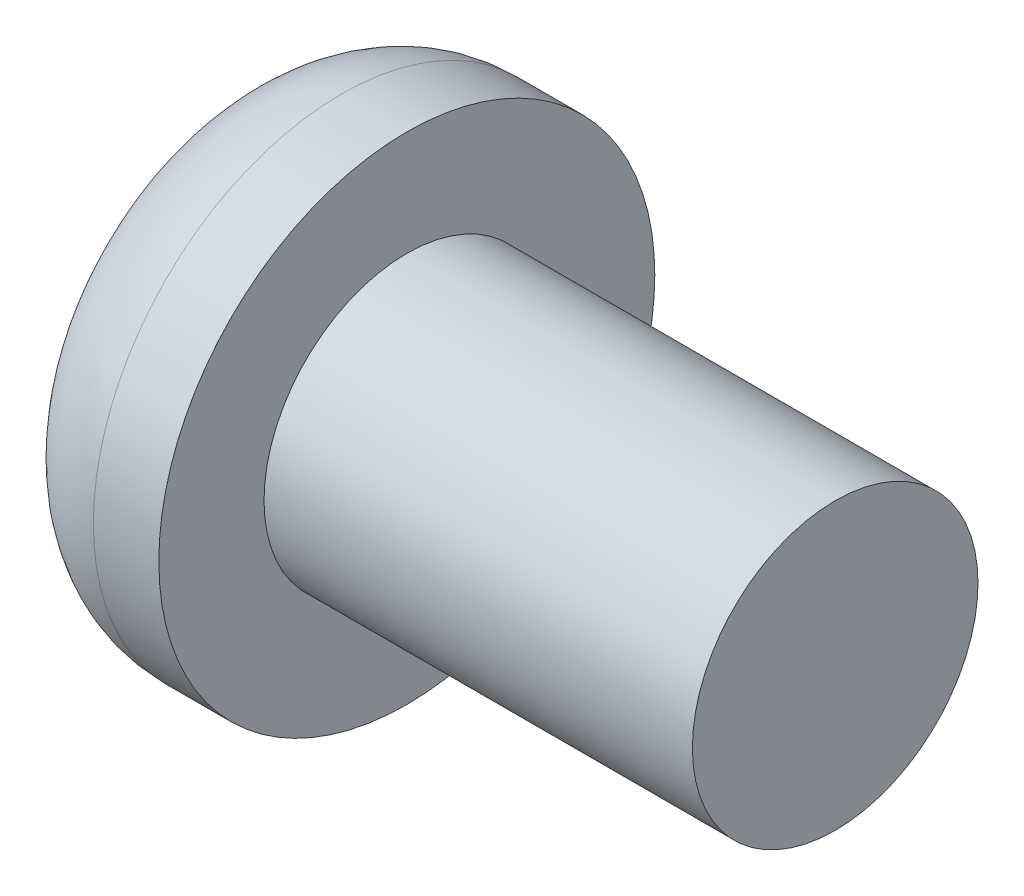
ISO-10303-21;
HEADER;
FILE_DESCRIPTION(('STEP AP214'),'2;1');
FILE_NAME('part.step','',(''),(''),'','','');
FILE_SCHEMA(('AUTOMOTIVE_DESIGN { 1 0 10303 214 1 1 1 1 }'));
ENDSEC;
DATA;
#1=APPLICATION_CONTEXT('core data for automotive mechanical design processes');
#2=APPLICATION_PROTOCOL_DEFINITION('international standard','automotive_design',2000,#1);
#3=PRODUCT_CONTEXT('',#1,'mechanical');
#4=PRODUCT('Part','Part','',(#3));
#5=PRODUCT_RELATED_PRODUCT_CATEGORY('part','',(#4));
#6=PRODUCT_DEFINITION_FORMATION('','',#4);
#7=PRODUCT_DEFINITION_CONTEXT('part definition',#1,'design');
#8=PRODUCT_DEFINITION('design','',#6,#7);
#9=PRODUCT_DEFINITION_SHAPE('','',#8);
#10=(LENGTH_UNIT() NAMED_UNIT(*) SI_UNIT(.MILLI.,.METRE.));
#11=(NAMED_UNIT(*) PLANE_ANGLE_UNIT() SI_UNIT($,.RADIAN.));
#12=(NAMED_UNIT(*) SI_UNIT($,.STERADIAN.) SOLID_ANGLE_UNIT());
#13=UNCERTAINTY_MEASURE_WITH_UNIT(LENGTH_MEASURE(1.E-05),#10,'distance_accuracy_value','');
#14=(GEOMETRIC_REPRESENTATION_CONTEXT(3) GLOBAL_UNCERTAINTY_ASSIGNED_CONTEXT((#13)) GLOBAL_UNIT_ASSIGNED_CONTEXT((#10,
#11,#12)) REPRESENTATION_CONTEXT('',''));
#15=CARTESIAN_POINT('',(0.,0.,0.));
#16=DIRECTION('',(0.,0.,1.));
#17=DIRECTION('',(1.,0.,0.));
#18=AXIS2_PLACEMENT_3D('',#15,#16,#17);
#19=CARTESIAN_POINT('',(4.5,0.,0.));
#20=DIRECTION('',(1.,0.,0.));
#21=DIRECTION('',(0.,1.,0.));
#22=AXIS2_PLACEMENT_3D('',#19,#20,#21);
#23=PLANE('',#22);
#24=CARTESIAN_POINT('',(4.5,0.,0.));
#25=DIRECTION('',(1.,0.,0.));
#26=DIRECTION('',(0.,0.,-1.));
#27=AXIS2_PLACEMENT_3D('',#24,#25,#26);
#28=CIRCLE('',#27,1.5);
#29=CARTESIAN_POINT('',(4.5,-1.5,0.));
#30=VERTEX_POINT('',#29);
#31=EDGE_CURVE('E28',#30,#30,#28,.T.);
#32=ORIENTED_EDGE('',*,*,#31,.T.);
#33=EDGE_LOOP('',(#32));
#34=FACE_BOUND('',#33,.T.);
#35=ADVANCED_FACE('F16',(#34),#23,.T.);
#36=CARTESIAN_POINT('',(2.25,0.,0.));
#37=DIRECTION('',(1.,0.,0.));
#38=DIRECTION('',(0.,1.,0.));
#39=AXIS2_PLACEMENT_3D('',#36,#37,#38);
#40=CYLINDRICAL_SURFACE('',#39,1.5);
#41=ORIENTED_EDGE('',*,*,#31,.F.);
#42=DIRECTION('',(-1.,0.,0.));
#43=VECTOR('',#42,1.);
#44=CARTESIAN_POINT('',(2.25,-1.5,0.));
#45=LINE('',#44,#43);
#46=CARTESIAN_POINT('',(0.,-1.5,0.));
#47=VERTEX_POINT('',#46);
#48=EDGE_CURVE('E11',#30,#47,#45,.T.);
#49=ORIENTED_EDGE('',*,*,#48,.T.);
#50=CARTESIAN_POINT('',(0.,0.,0.));
#51=DIRECTION('',(1.,0.,0.));
#52=DIRECTION('',(0.,0.,-1.));
#53=AXIS2_PLACEMENT_3D('',#50,#51,#52);
#54=CIRCLE('',#53,1.5);
#55=EDGE_CURVE('E375',#47,#47,#54,.T.);
#56=ORIENTED_EDGE('',*,*,#55,.T.);
#57=ORIENTED_EDGE('',*,*,#48,.F.);
#58=EDGE_LOOP('',(#41,#49,#56,#57));
#59=FACE_BOUND('',#58,.T.);
#60=ADVANCED_FACE('F315',(#59),#40,.T.);
#61=CARTESIAN_POINT('',(0.,1.5,0.));
#62=DIRECTION('',(1.,0.,0.));
#63=DIRECTION('',(0.,1.,0.));
#64=AXIS2_PLACEMENT_3D('',#61,#62,#63);
#65=PLANE('',#64);
#66=ORIENTED_EDGE('',*,*,#55,.F.);
#67=EDGE_LOOP('',(#66));
#68=FACE_BOUND('',#67,.T.);
#69=CARTESIAN_POINT('',(0.,0.,0.));
#70=DIRECTION('',(1.,0.,0.));
#71=DIRECTION('',(0.,0.,-1.));
#72=AXIS2_PLACEMENT_3D('',#69,#70,#71);
#73=CIRCLE('',#72,2.605);
#74=CARTESIAN_POINT('',(0.,-2.605,0.));
#75=VERTEX_POINT('',#74);
#76=EDGE_CURVE('E390',#75,#75,#73,.T.);
#77=ORIENTED_EDGE('',*,*,#76,.T.);
#78=EDGE_LOOP('',(#77));
#79=FACE_BOUND('',#78,.T.);
#80=ADVANCED_FACE('F318',(#68,#79),#65,.T.);
#81=CARTESIAN_POINT('',(-0.344060913722693,0.,0.));
#82=DIRECTION('',(1.,0.,0.));
#83=DIRECTION('',(0.,1.,0.));
#84=AXIS2_PLACEMENT_3D('',#81,#82,#83);
#85=CYLINDRICAL_SURFACE('',#84,2.605);
#86=ORIENTED_EDGE('',*,*,#76,.F.);
#87=DIRECTION('',(-1.,0.,0.));
#88=VECTOR('',#87,1.);
#89=CARTESIAN_POINT('',(-0.344060913722693,-2.605,0.));
#90=LINE('',#89,#88);
#91=CARTESIAN_POINT('',(-0.688121827445386,-2.605,0.));
#92=VERTEX_POINT('',#91);
#93=EDGE_CURVE('E394',#75,#92,#90,.T.);
#94=ORIENTED_EDGE('',*,*,#93,.T.);
#95=CARTESIAN_POINT('',(-0.688121827445386,0.,0.));
#96=DIRECTION('',(1.,0.,0.));
#97=DIRECTION('',(0.,0.,-1.));
#98=AXIS2_PLACEMENT_3D('',#95,#96,#97);
#99=CIRCLE('',#98,2.605);
#100=CARTESIAN_POINT('',(-0.688121827445386,0.,2.605));
#101=VERTEX_POINT('',#100);
#102=EDGE_CURVE('E382',#92,#101,#99,.T.);
#103=ORIENTED_EDGE('',*,*,#102,.T.);
#104=CARTESIAN_POINT('',(-0.688121827445386,0.,0.));
#105=DIRECTION('',(1.,0.,0.));
#106=DIRECTION('',(0.,0.,-1.));
#107=AXIS2_PLACEMENT_3D('',#104,#105,#106);
#108=CIRCLE('',#107,2.605);
#109=EDGE_CURVE('E386',#101,#92,#108,.T.);
#110=ORIENTED_EDGE('',*,*,#109,.T.);
#111=ORIENTED_EDGE('',*,*,#93,.F.);
#112=EDGE_LOOP('',(#86,#94,#103,#110,#111));
#113=FACE_BOUND('',#112,.T.);
#114=ADVANCED_FACE('F683',(#113),#85,.T.);
#115=CARTESIAN_POINT('',(8.07814700639857,0.,0.));
#116=DIRECTION('',(0.,0.,1.));
#117=DIRECTION('',(1.,0.,0.));
#118=AXIS2_PLACEMENT_3D('',#115,#116,#117);
#119=SPHERICAL_SURFACE('',#118,10.0781470063986);
#120=CARTESIAN_POINT('',(8.07814700639857,0.,0.325));
#121=DIRECTION('',(0.,0.,1.));
#122=DIRECTION('',(0.,1.,0.));
#123=AXIS2_PLACEMENT_3D('',#120,#121,#122);
#124=CIRCLE('',#123,10.072905344665);
#125=CARTESIAN_POINT('',(-1.98951394749635,-0.325,0.325));
#126=VERTEX_POINT('',#125);
#127=CARTESIAN_POINT('',(-1.873,-1.5614401492293,0.325));
#128=VERTEX_POINT('',#127);
#129=EDGE_CURVE('E370',#126,#128,#124,.T.);
#130=ORIENTED_EDGE('',*,*,#129,.T.);
#131=CARTESIAN_POINT('',(-1.873,0.,0.));
#132=DIRECTION('',(1.,0.,0.));
#133=DIRECTION('',(0.,0.,-1.));
#134=AXIS2_PLACEMENT_3D('',#131,#132,#133);
#135=CIRCLE('',#134,1.59490449232085);
#136=CARTESIAN_POINT('',(-1.873,-0.325,1.5614401492293));
#137=VERTEX_POINT('',#136);
#138=EDGE_CURVE('E63',#137,#128,#135,.T.);
#139=ORIENTED_EDGE('',*,*,#138,.F.);
#140=CARTESIAN_POINT('',(8.07814700639857,-0.325,0.));
#141=DIRECTION('',(0.,-1.,0.));
#142=DIRECTION('',(0.,0.,1.));
#143=AXIS2_PLACEMENT_3D('',#140,#141,#142);
#144=CIRCLE('',#143,10.072905344665);
#145=EDGE_CURVE('E440',#137,#126,#144,.T.);
#146=ORIENTED_EDGE('',*,*,#145,.T.);
#147=EDGE_LOOP('',(#130,#139,#146));
#148=FACE_BOUND('',#147,.T.);
#149=ADVANCED_FACE('F673',(#148),#119,.T.);
#150=CARTESIAN_POINT('',(8.07814700639857,0.,0.));
#151=DIRECTION('',(0.,0.,1.));
#152=DIRECTION('',(1.,0.,0.));
#153=AXIS2_PLACEMENT_3D('',#150,#151,#152);
#154=SPHERICAL_SURFACE('',#153,10.0781470063986);
#155=CARTESIAN_POINT('',(8.07814700639857,0.,0.325));
#156=DIRECTION('',(0.,0.,1.));
#157=DIRECTION('',(0.,1.,0.));
#158=AXIS2_PLACEMENT_3D('',#155,#156,#157);
#159=CIRCLE('',#158,10.072905344665);
#160=CARTESIAN_POINT('',(-1.873,1.5614401492293,0.325));
#161=VERTEX_POINT('',#160);
#162=CARTESIAN_POINT('',(-1.98951394749635,0.325,0.325));
#163=VERTEX_POINT('',#162);
#164=EDGE_CURVE('E519',#161,#163,#159,.T.);
#165=ORIENTED_EDGE('',*,*,#164,.T.);
#166=CARTESIAN_POINT('',(8.07814700639857,0.325,0.));
#167=DIRECTION('',(0.,1.,0.));
#168=DIRECTION('',(0.,0.,-1.));
#169=AXIS2_PLACEMENT_3D('',#166,#167,#168);
#170=CIRCLE('',#169,10.072905344665);
#171=CARTESIAN_POINT('',(-1.873,0.325,1.5614401492293));
#172=VERTEX_POINT('',#171);
#173=EDGE_CURVE('E426',#163,#172,#170,.T.);
#174=ORIENTED_EDGE('',*,*,#173,.T.);
#175=CARTESIAN_POINT('',(-1.873,0.,0.));
#176=DIRECTION('',(1.,0.,0.));
#177=DIRECTION('',(0.,0.,-1.));
#178=AXIS2_PLACEMENT_3D('',#175,#176,#177);
#179=CIRCLE('',#178,1.59490449232085);
#180=EDGE_CURVE('E224',#161,#172,#179,.T.);
#181=ORIENTED_EDGE('',*,*,#180,.F.);
#182=EDGE_LOOP('',(#165,#174,#181));
#183=FACE_BOUND('',#182,.T.);
#184=ADVANCED_FACE('F670',(#183),#154,.T.);
#185=CARTESIAN_POINT('',(-0.35,0.,0.325));
#186=DIRECTION('',(1.,0.,0.));
#187=DIRECTION('',(0.,1.,0.));
#188=AXIS2_PLACEMENT_3D('',#185,#186,#187);
#189=PLANE('',#188);
#190=DIRECTION('',(0.,1.,0.));
#191=VECTOR('',#190,1.);
#192=CARTESIAN_POINT('',(-0.35,0.,-0.325));
#193=LINE('',#192,#191);
#194=CARTESIAN_POINT('',(-0.35,-0.325,-0.325));
#195=VERTEX_POINT('',#194);
#196=CARTESIAN_POINT('',(-0.35,0.325,-0.325));
#197=VERTEX_POINT('',#196);
#198=EDGE_CURVE('E179',#195,#197,#193,.T.);
#199=ORIENTED_EDGE('',*,*,#198,.F.);
#200=DIRECTION('',(0.,0.,1.));
#201=VECTOR('',#200,1.);
#202=CARTESIAN_POINT('',(-0.35,-0.325,0.325));
#203=LINE('',#202,#201);
#204=CARTESIAN_POINT('',(-0.35,-0.325,0.325));
#205=VERTEX_POINT('',#204);
#206=EDGE_CURVE('E339',#195,#205,#203,.T.);
#207=ORIENTED_EDGE('',*,*,#206,.T.);
#208=DIRECTION('',(0.,-1.,0.));
#209=VECTOR('',#208,1.);
#210=CARTESIAN_POINT('',(-0.35,0.,0.325));
#211=LINE('',#210,#209);
#212=CARTESIAN_POINT('',(-0.35,0.325,0.325));
#213=VERTEX_POINT('',#212);
#214=EDGE_CURVE('E387',#213,#205,#211,.T.);
#215=ORIENTED_EDGE('',*,*,#214,.F.);
#216=DIRECTION('',(0.,0.,-1.));
#217=VECTOR('',#216,1.);
#218=CARTESIAN_POINT('',(-0.35,0.325,0.325));
#219=LINE('',#218,#217);
#220=EDGE_CURVE('E354',#213,#197,#219,.T.);
#221=ORIENTED_EDGE('',*,*,#220,.T.);
#222=EDGE_LOOP('',(#199,#207,#215,#221));
#223=FACE_BOUND('',#222,.T.);
#224=ADVANCED_FACE('F672',(#223),#189,.F.);
#225=CARTESIAN_POINT('',(-2.35,0.,2.325));
#226=DIRECTION('',(0.707106781186548,0.,0.707106781186547));
#227=DIRECTION('',(0.,-1.,0.));
#228=AXIS2_PLACEMENT_3D('',#225,#226,#227);
#229=PLANE('',#228);
#230=CARTESIAN_POINT('',(-1.81452090341933,0.325,1.78952090341933));
#231=CARTESIAN_POINT('',(-1.81986884626208,0.214083503707451,1.79486884626208));
#232=CARTESIAN_POINT('',(-1.82221502284598,0.104997635973113,1.79721502284598));
#233=CARTESIAN_POINT('',(-1.82221502284598,0.,1.79721502284598));
#234=(BOUNDED_CURVE() B_SPLINE_CURVE(3,(#230,#231,#232,#233),.UNSPECIFIED.,.F.,
.F.) B_SPLINE_CURVE_WITH_KNOTS((4,4),(-0.031499290791934,0.),
.UNSPECIFIED.) CURVE() GEOMETRIC_REPRESENTATION_ITEM() RATIONAL_B_SPLINE_CURVE((1.,1.,1.,1.)) REPRESENTATION_ITEM(''));
#235=CARTESIAN_POINT('',(-1.81452090341933,0.325,1.78952090341933));
#236=VERTEX_POINT('',#235);
#237=CARTESIAN_POINT('',(-1.82221502284598,0.,1.79721502284598));
#238=VERTEX_POINT('',#237);
#239=EDGE_CURVE('E219',#236,#238,#234,.T.);
#240=ORIENTED_EDGE('',*,*,#239,.F.);
#241=DIRECTION('',(0.707106781186547,0.,-0.707106781186548));
#242=VECTOR('',#241,1.);
#243=CARTESIAN_POINT('',(-2.35,0.325,2.325));
#244=LINE('',#243,#242);
#245=EDGE_CURVE('E182',#236,#213,#244,.T.);
#246=ORIENTED_EDGE('',*,*,#245,.T.);
#247=ORIENTED_EDGE('',*,*,#214,.T.);
#248=DIRECTION('',(-0.707106781186547,0.,0.707106781186548));
#249=VECTOR('',#248,1.);
#250=CARTESIAN_POINT('',(-2.35,-0.325,2.325));
#251=LINE('',#250,#249);
#252=CARTESIAN_POINT('',(-1.81452090341933,-0.325,1.78952090341933));
#253=VERTEX_POINT('',#252);
#254=EDGE_CURVE('E446',#205,#253,#251,.T.);
#255=ORIENTED_EDGE('',*,*,#254,.T.);
#256=CARTESIAN_POINT('',(-1.82221502284598,0.,1.79721502284598));
#257=CARTESIAN_POINT('',(-1.82221502284598,-0.104997635628917,1.79721502284598));
#258=CARTESIAN_POINT('',(-1.81986884626694,-0.214083503606615,1.79486884626694));
#259=CARTESIAN_POINT('',(-1.81452090341933,-0.325,1.78952090341933));
#260=(BOUNDED_CURVE() B_SPLINE_CURVE(3,(#256,#257,#258,#259),.UNSPECIFIED.,.F.,
.F.) B_SPLINE_CURVE_WITH_KNOTS((4,4),(0.,0.031499290688675),
.UNSPECIFIED.) CURVE() GEOMETRIC_REPRESENTATION_ITEM() RATIONAL_B_SPLINE_CURVE((1.,1.,1.,1.)) REPRESENTATION_ITEM(''));
#261=EDGE_CURVE('E470',#238,#253,#260,.T.);
#262=ORIENTED_EDGE('',*,*,#261,.F.);
#263=EDGE_LOOP('',(#240,#246,#247,#255,#262));
#264=FACE_BOUND('',#263,.T.);
#265=ADVANCED_FACE('F680',(#264),#229,.F.);
#266=CARTESIAN_POINT('',(-0.35,0.,-0.325));
#267=DIRECTION('',(0.707106781186548,0.,-0.707106781186547));
#268=DIRECTION('',(0.,-1.,0.));
#269=AXIS2_PLACEMENT_3D('',#266,#267,#268);
#270=PLANE('',#269);
#271=CARTESIAN_POINT('',(-1.81452090341933,-0.325,-1.78952090341933));
#272=CARTESIAN_POINT('',(-1.81986884626208,-0.214083503707451,-1.79486884626208));
#273=CARTESIAN_POINT('',(-1.82221502284598,-0.104997635973113,-1.79721502284598));
#274=CARTESIAN_POINT('',(-1.82221502284598,0.,-1.79721502284598));
#275=CARTESIAN_POINT('',(-1.82221502284598,0.104997635628917,-1.79721502284598));
#276=CARTESIAN_POINT('',(-1.81986884626694,0.214083503606615,-1.79486884626694));
#277=CARTESIAN_POINT('',(-1.81452090341933,0.325,-1.78952090341933));
#278=(BOUNDED_CURVE() B_SPLINE_CURVE(3,(#271,#272,#273,#274,#275,#276,#277),.UNSPECIFIED.,.F.,
.F.) B_SPLINE_CURVE_WITH_KNOTS((4,3,4),(-0.031499290791934,0.,0.031499290688675),
.UNSPECIFIED.) CURVE() GEOMETRIC_REPRESENTATION_ITEM() RATIONAL_B_SPLINE_CURVE((1.,1.,1.,1.,1.,
1.,1.)) REPRESENTATION_ITEM(''));
#279=CARTESIAN_POINT('',(-1.81452090341933,-0.325,-1.78952090341933));
#280=VERTEX_POINT('',#279);
#281=CARTESIAN_POINT('',(-1.81452090341933,0.325,-1.78952090341933));
#282=VERTEX_POINT('',#281);
#283=EDGE_CURVE('E177',#280,#282,#278,.T.);
#284=ORIENTED_EDGE('',*,*,#283,.F.);
#285=DIRECTION('',(0.707106781186547,0.,0.707106781186548));
#286=VECTOR('',#285,1.);
#287=CARTESIAN_POINT('',(-0.35,-0.325,-0.325));
#288=LINE('',#287,#286);
#289=EDGE_CURVE('E544',#280,#195,#288,.T.);
#290=ORIENTED_EDGE('',*,*,#289,.T.);
#291=ORIENTED_EDGE('',*,*,#198,.T.);
#292=DIRECTION('',(-0.707106781186547,0.,-0.707106781186548));
#293=VECTOR('',#292,1.);
#294=CARTESIAN_POINT('',(-0.35,0.325,-0.325));
#295=LINE('',#294,#293);
#296=EDGE_CURVE('E173',#197,#282,#295,.T.);
#297=ORIENTED_EDGE('',*,*,#296,.T.);
#298=EDGE_LOOP('',(#284,#290,#291,#297));
#299=FACE_BOUND('',#298,.T.);
#300=ADVANCED_FACE('F174',(#299),#270,.F.);
#301=CARTESIAN_POINT('',(-1.35,-0.325,0.));
#302=DIRECTION('',(0.,-1.,0.));
#303=DIRECTION('',(0.,0.,-1.));
#304=AXIS2_PLACEMENT_3D('',#301,#302,#303);
#305=PLANE('',#304);
#306=DIRECTION('',(-1.,0.,0.));
#307=VECTOR('',#306,1.);
#308=CARTESIAN_POINT('',(-1.35,-0.325,0.325));
#309=LINE('',#308,#307);
#310=EDGE_CURVE('E366',#205,#126,#309,.T.);
#311=ORIENTED_EDGE('',*,*,#310,.T.);
#312=ORIENTED_EDGE('',*,*,#145,.F.);
#313=CARTESIAN_POINT('',(-1.81452090341933,-0.325000000000002,1.78952090341933));
#314=CARTESIAN_POINT('',(-1.81802181106117,-0.325000006037163,1.77983519150542));
#315=CARTESIAN_POINT('',(-1.82140044209688,-0.325000121164128,1.77010530184731));
#316=CARTESIAN_POINT('',(-1.82786887193116,-0.325000440927639,1.75069169359607));
#317=CARTESIAN_POINT('',(-1.83096187819348,-0.325000644370204,1.74100904363125));
#318=CARTESIAN_POINT('',(-1.83686714219303,-0.325001016354931,1.72169923093882));
#319=CARTESIAN_POINT('',(-1.83968258625238,-0.325001185325204,1.71207304247435));
#320=CARTESIAN_POINT('',(-1.84504102078273,-0.325001418867752,1.69288497280706));
#321=CARTESIAN_POINT('',(-1.8475871727544,-0.325001484816823,1.68332397433987));
#322=CARTESIAN_POINT('',(-1.85241544154648,-0.325001486783197,1.66427460778601));
#323=CARTESIAN_POINT('',(-1.85470069233999,-0.325001424564613,1.65478703389266));
#324=CARTESIAN_POINT('',(-1.85901569712166,-0.325001193823365,1.63589235306207));
#325=CARTESIAN_POINT('',(-1.86104855472639,-0.32500102678683,1.62648595476778));
#326=CARTESIAN_POINT('',(-1.86486739167853,-0.325000653189713,1.60776098439932));
#327=CARTESIAN_POINT('',(-1.86665644183461,-0.325000447218223,1.59844303843556));
#328=CARTESIAN_POINT('',(-1.86999638990841,-0.325000126525588,1.57990186203197));
#329=CARTESIAN_POINT('',(-1.8715503228261,-0.325000010543842,1.57067917824482));
#330=CARTESIAN_POINT('',(-1.873,-0.324999999999997,1.5614401492293));
#331=B_SPLINE_CURVE_WITH_KNOTS('',3,(#313,#314,#315,#316,#317,#318,#319,#320,#321,#322,#323,
#324,#325,#326,#327,#328,#329,#330),.UNSPECIFIED.,.F.,.F.,(4,2,2,2,2,2,2,2,4),(0.,
0.0308961438615368,0.0613869976936338,0.0914724017263434,0.12115218994959,0.150426192998161,
0.179294241002049,0.207756166397346,0.235811806694645),.UNSPECIFIED.);
#332=EDGE_CURVE('E205',#253,#137,#331,.T.);
#333=ORIENTED_EDGE('',*,*,#332,.F.);
#334=ORIENTED_EDGE('',*,*,#254,.F.);
#335=EDGE_LOOP('',(#311,#312,#333,#334));
#336=FACE_BOUND('',#335,.T.);
#337=ADVANCED_FACE('F18',(#336),#305,.F.);
#338=CARTESIAN_POINT('',(8.07814700639857,0.,0.));
#339=DIRECTION('',(0.,0.,1.));
#340=DIRECTION('',(1.,0.,0.));
#341=AXIS2_PLACEMENT_3D('',#338,#339,#340);
#342=SPHERICAL_SURFACE('',#341,10.0781470063986);
#343=CARTESIAN_POINT('',(8.07814700639857,0.,-0.325));
#344=DIRECTION('',(0.,0.,-1.));
#345=DIRECTION('',(0.,-1.,0.));
#346=AXIS2_PLACEMENT_3D('',#343,#344,#345);
#347=CIRCLE('',#346,10.072905344665);
#348=CARTESIAN_POINT('',(-1.98951394749635,0.325,-0.325));
#349=VERTEX_POINT('',#348);
#350=CARTESIAN_POINT('',(-1.873,1.5614401492293,-0.325));
#351=VERTEX_POINT('',#350);
#352=EDGE_CURVE('E298',#349,#351,#347,.T.);
#353=ORIENTED_EDGE('',*,*,#352,.T.);
#354=CARTESIAN_POINT('',(-1.873,0.,0.));
#355=DIRECTION('',(1.,0.,0.));
#356=DIRECTION('',(0.,0.,-1.));
#357=AXIS2_PLACEMENT_3D('',#354,#355,#356);
#358=CIRCLE('',#357,1.59490449232085);
#359=CARTESIAN_POINT('',(-1.873,0.325,-1.5614401492293));
#360=VERTEX_POINT('',#359);
#361=EDGE_CURVE('E190',#360,#351,#358,.T.);
#362=ORIENTED_EDGE('',*,*,#361,.F.);
#363=CARTESIAN_POINT('',(8.07814700639857,0.325,0.));
#364=DIRECTION('',(0.,1.,0.));
#365=DIRECTION('',(0.,0.,-1.));
#366=AXIS2_PLACEMENT_3D('',#363,#364,#365);
#367=CIRCLE('',#366,10.072905344665);
#368=EDGE_CURVE('E167',#360,#349,#367,.T.);
#369=ORIENTED_EDGE('',*,*,#368,.T.);
#370=EDGE_LOOP('',(#353,#362,#369));
#371=FACE_BOUND('',#370,.T.);
#372=ADVANCED_FACE('F311',(#371),#342,.T.);
#373=CARTESIAN_POINT('',(-1.35,0.325,0.));
#374=DIRECTION('',(0.,1.,0.));
#375=DIRECTION('',(1.,0.,0.));
#376=AXIS2_PLACEMENT_3D('',#373,#374,#375);
#377=PLANE('',#376);
#378=DIRECTION('',(1.,0.,0.));
#379=VECTOR('',#378,1.);
#380=CARTESIAN_POINT('',(-1.35,0.325,0.325));
#381=LINE('',#380,#379);
#382=EDGE_CURVE('E338',#163,#213,#381,.T.);
#383=ORIENTED_EDGE('',*,*,#382,.T.);
#384=ORIENTED_EDGE('',*,*,#245,.F.);
#385=CARTESIAN_POINT('',(-1.873,0.324999999999999,1.5614401492293));
#386=CARTESIAN_POINT('',(-1.8715503228261,0.325000010543844,1.57067917824482));
#387=CARTESIAN_POINT('',(-1.86999638990841,0.325000126525589,1.57990186203197));
#388=CARTESIAN_POINT('',(-1.86665644183462,0.325000447218225,1.59844303843555));
#389=CARTESIAN_POINT('',(-1.86486739167853,0.325000653189714,1.60776098439932));
#390=CARTESIAN_POINT('',(-1.86104855472639,0.325001026786831,1.62648595476777));
#391=CARTESIAN_POINT('',(-1.85901569712166,0.325001193823366,1.63589235306206));
#392=CARTESIAN_POINT('',(-1.85470069233999,0.325001424564613,1.65478703389265));
#393=CARTESIAN_POINT('',(-1.85241544154648,0.325001486783197,1.664274607786));
#394=CARTESIAN_POINT('',(-1.8475871727544,0.325001484816822,1.68332397433986));
#395=CARTESIAN_POINT('',(-1.84504102078273,0.325001418867751,1.69288497280705));
#396=CARTESIAN_POINT('',(-1.83968258625238,0.325001185325201,1.71207304247435));
#397=CARTESIAN_POINT('',(-1.83686714219303,0.325001016354927,1.72169923093881));
#398=CARTESIAN_POINT('',(-1.83096187819348,0.3250006443702,1.74100904363125));
#399=CARTESIAN_POINT('',(-1.82786887193116,0.325000440927634,1.75069169359607));
#400=CARTESIAN_POINT('',(-1.82140044209688,0.325000121164122,1.77010530184731));
#401=CARTESIAN_POINT('',(-1.81802181106117,0.325000006037157,1.77983519150542));
#402=CARTESIAN_POINT('',(-1.81452090341933,0.324999999999995,1.78952090341933));
#403=B_SPLINE_CURVE_WITH_KNOTS('',3,(#385,#386,#387,#388,#389,#390,#391,#392,#393,#394,#395,
#396,#397,#398,#399,#400,#401,#402),.UNSPECIFIED.,.F.,.F.,(4,2,2,2,2,2,2,2,4),(0.,
0.0280556402972966,0.0565175656925924,0.0853856136964795,0.114659616745051,0.144339404968298,
0.174424809001008,0.204915662833108,0.235811806694647),.UNSPECIFIED.);
#404=EDGE_CURVE('E403',#172,#236,#403,.T.);
#405=ORIENTED_EDGE('',*,*,#404,.F.);
#406=ORIENTED_EDGE('',*,*,#173,.F.);
#407=EDGE_LOOP('',(#383,#384,#405,#406));
#408=FACE_BOUND('',#407,.T.);
#409=ADVANCED_FACE('F246',(#408),#377,.F.);
#410=CARTESIAN_POINT('',(-1.35,0.325,0.));
#411=DIRECTION('',(0.,1.,0.));
#412=DIRECTION('',(1.,0.,0.));
#413=AXIS2_PLACEMENT_3D('',#410,#411,#412);
#414=PLANE('',#413);
#415=DIRECTION('',(-1.,0.,0.));
#416=VECTOR('',#415,1.);
#417=CARTESIAN_POINT('',(-1.35,0.325,-0.325));
#418=LINE('',#417,#416);
#419=EDGE_CURVE('E377',#197,#349,#418,.T.);
#420=ORIENTED_EDGE('',*,*,#419,.T.);
#421=ORIENTED_EDGE('',*,*,#368,.F.);
#422=CARTESIAN_POINT('',(-1.81452090341933,0.325,-1.78952090341933));
#423=CARTESIAN_POINT('',(-1.81802181106117,0.325000006037161,-1.77983519150542));
#424=CARTESIAN_POINT('',(-1.82140044209688,0.325000121164126,-1.77010530184731));
#425=CARTESIAN_POINT('',(-1.82786887193116,0.325000440927638,-1.75069169359607));
#426=CARTESIAN_POINT('',(-1.83096187819348,0.325000644370204,-1.74100904363125));
#427=CARTESIAN_POINT('',(-1.83686714219303,0.32500101635493,-1.72169923093882));
#428=CARTESIAN_POINT('',(-1.83968258625238,0.325001185325203,-1.71207304247435));
#429=CARTESIAN_POINT('',(-1.84504102078273,0.325001418867752,-1.69288497280706));
#430=CARTESIAN_POINT('',(-1.8475871727544,0.325001484816823,-1.68332397433987));
#431=CARTESIAN_POINT('',(-1.85241544154648,0.325001486783198,-1.66427460778601));
#432=CARTESIAN_POINT('',(-1.85470069233999,0.325001424564614,-1.65478703389266));
#433=CARTESIAN_POINT('',(-1.85901569712166,0.325001193823367,-1.63589235306206));
#434=CARTESIAN_POINT('',(-1.86104855472639,0.325001026786832,-1.62648595476777));
#435=CARTESIAN_POINT('',(-1.86486739167853,0.325000653189715,-1.60776098439932));
#436=CARTESIAN_POINT('',(-1.86665644183461,0.325000447218226,-1.59844303843556));
#437=CARTESIAN_POINT('',(-1.86999638990841,0.325000126525591,-1.57990186203197));
#438=CARTESIAN_POINT('',(-1.8715503228261,0.325000010543845,-1.57067917824482));
#439=CARTESIAN_POINT('',(-1.873,0.325,-1.5614401492293));
#440=B_SPLINE_CURVE_WITH_KNOTS('',3,(#422,#423,#424,#425,#426,#427,#428,#429,#430,#431,#432,
#433,#434,#435,#436,#437,#438,#439),.UNSPECIFIED.,.F.,.F.,(4,2,2,2,2,2,2,2,4),(0.,
0.0308961438615368,0.061386997693634,0.0914724017263436,0.12115218994959,0.150426192998162,
0.17929424100205,0.207756166397347,0.235811806694645),.UNSPECIFIED.);
#441=EDGE_CURVE('E185',#282,#360,#440,.T.);
#442=ORIENTED_EDGE('',*,*,#441,.F.);
#443=ORIENTED_EDGE('',*,*,#296,.F.);
#444=EDGE_LOOP('',(#420,#421,#442,#443));
#445=FACE_BOUND('',#444,.T.);
#446=ADVANCED_FACE('F187',(#445),#414,.F.);
#447=CARTESIAN_POINT('',(-0.688121827445386,0.,0.));
#448=DIRECTION('',(1.,0.,0.));
#449=DIRECTION('',(0.,0.,-1.));
#450=AXIS2_PLACEMENT_3D('',#447,#448,#449);
#451=TOROIDAL_SURFACE('',#450,1.405,1.2);
#452=ORIENTED_EDGE('',*,*,#102,.F.);
#453=ORIENTED_EDGE('',*,*,#109,.F.);
#454=CARTESIAN_POINT('',(-0.688121827445386,0.,1.405));
#455=DIRECTION('',(0.,-1.,0.));
#456=DIRECTION('',(0.,0.,1.));
#457=AXIS2_PLACEMENT_3D('',#454,#455,#456);
#458=CIRCLE('',#457,1.2);
#459=EDGE_CURVE('E476',#101,#238,#458,.T.);
#460=ORIENTED_EDGE('',*,*,#459,.T.);
#461=ORIENTED_EDGE('',*,*,#261,.T.);
#462=ORIENTED_EDGE('',*,*,#332,.T.);
#463=ORIENTED_EDGE('',*,*,#138,.T.);
#464=CARTESIAN_POINT('',(-1.873,-1.5614401492293,0.324999999999993));
#465=CARTESIAN_POINT('',(-1.8715503228261,-1.57067917824482,0.325000010543838));
#466=CARTESIAN_POINT('',(-1.86999638990841,-1.57990186203197,0.325000126525584));
#467=CARTESIAN_POINT('',(-1.86665644183462,-1.59844303843555,0.32500044721822));
#468=CARTESIAN_POINT('',(-1.86486739167853,-1.60776098439932,0.32500065318971));
#469=CARTESIAN_POINT('',(-1.86104855472639,-1.62648595476777,0.325001026786827));
#470=CARTESIAN_POINT('',(-1.85901569712166,-1.63589235306206,0.325001193823361));
#471=CARTESIAN_POINT('',(-1.85470069233999,-1.65478703389265,0.325001424564609));
#472=CARTESIAN_POINT('',(-1.85241544154648,-1.664274607786,0.325001486783194));
#473=CARTESIAN_POINT('',(-1.8475871727544,-1.68332397433986,0.325001484816821));
#474=CARTESIAN_POINT('',(-1.84504102078273,-1.69288497280705,0.325001418867751));
#475=CARTESIAN_POINT('',(-1.83968258625238,-1.71207304247435,0.325001185325203));
#476=CARTESIAN_POINT('',(-1.83686714219303,-1.72169923093881,0.32500101635493));
#477=CARTESIAN_POINT('',(-1.83096187819348,-1.74100904363125,0.325000644370206));
#478=CARTESIAN_POINT('',(-1.82786887193116,-1.75069169359607,0.325000440927642));
#479=CARTESIAN_POINT('',(-1.82140044209688,-1.77010530184731,0.325000121164133));
#480=CARTESIAN_POINT('',(-1.81802181106117,-1.77983519150542,0.325000006037169));
#481=CARTESIAN_POINT('',(-1.81452090341933,-1.78952090341933,0.325000000000008));
#482=B_SPLINE_CURVE_WITH_KNOTS('',3,(#464,#465,#466,#467,#468,#469,#470,#471,#472,#473,#474,
#475,#476,#477,#478,#479,#480,#481),.UNSPECIFIED.,.F.,.F.,(4,2,2,2,2,2,2,2,4),(0.,
0.0280556402972962,0.056517565692592,0.0853856136964791,0.11465961674505,0.144339404968296,
0.174424809001006,0.204915662833105,0.235811806694643),.UNSPECIFIED.);
#483=CARTESIAN_POINT('',(-1.81452090341933,-1.78952090341933,0.325));
#484=VERTEX_POINT('',#483);
#485=EDGE_CURVE('E373',#128,#484,#482,.T.);
#486=ORIENTED_EDGE('',*,*,#485,.T.);
#487=CARTESIAN_POINT('',(-1.81452090341933,-1.78952090341933,0.325));
#488=CARTESIAN_POINT('',(-1.81986884626208,-1.79486884626208,0.214083503707451));
#489=CARTESIAN_POINT('',(-1.82221502284598,-1.79721502284598,0.104997635973113));
#490=CARTESIAN_POINT('',(-1.82221502284598,-1.79721502284598,0.));
#491=CARTESIAN_POINT('',(-1.82221502284598,-1.79721502284598,-0.104997635628916));
#492=CARTESIAN_POINT('',(-1.81986884626694,-1.79486884626694,-0.214083503606615));
#493=CARTESIAN_POINT('',(-1.81452090341933,-1.78952090341933,-0.325));
#494=(BOUNDED_CURVE() B_SPLINE_CURVE(3,(#487,#488,#489,#490,#491,#492,#493),.UNSPECIFIED.,.F.,
.F.) B_SPLINE_CURVE_WITH_KNOTS((4,3,4),(-0.0314992907919339,0.,0.031499290688675),
.UNSPECIFIED.) CURVE() GEOMETRIC_REPRESENTATION_ITEM() RATIONAL_B_SPLINE_CURVE((1.,1.,1.,1.,1.,
1.,1.)) REPRESENTATION_ITEM(''));
#495=CARTESIAN_POINT('',(-1.81452090341933,-1.78952090341933,-0.325));
#496=VERTEX_POINT('',#495);
#497=EDGE_CURVE('E530',#484,#496,#494,.T.);
#498=ORIENTED_EDGE('',*,*,#497,.T.);
#499=CARTESIAN_POINT('',(-1.81452090341933,-1.78952090341933,-0.325000000000009));
#500=CARTESIAN_POINT('',(-1.81802181106117,-1.77983519150542,-0.325000006037171));
#501=CARTESIAN_POINT('',(-1.82140044209688,-1.77010530184731,-0.325000121164135));
#502=CARTESIAN_POINT('',(-1.82786887193116,-1.75069169359607,-0.325000440927643));
#503=CARTESIAN_POINT('',(-1.83096187819348,-1.74100904363125,-0.325000644370206));
#504=CARTESIAN_POINT('',(-1.83686714219303,-1.72169923093882,-0.325001016354931));
#505=CARTESIAN_POINT('',(-1.83968258625238,-1.71207304247435,-0.325001185325205));
#506=CARTESIAN_POINT('',(-1.84504102078273,-1.69288497280706,-0.325001418867752));
#507=CARTESIAN_POINT('',(-1.8475871727544,-1.68332397433987,-0.325001484816822));
#508=CARTESIAN_POINT('',(-1.85241544154648,-1.66427460778601,-0.325001486783194));
#509=CARTESIAN_POINT('',(-1.85470069233999,-1.65478703389266,-0.325001424564611));
#510=CARTESIAN_POINT('',(-1.85901569712166,-1.63589235306207,-0.325001193823363));
#511=CARTESIAN_POINT('',(-1.86104855472639,-1.62648595476778,-0.325001026786827));
#512=CARTESIAN_POINT('',(-1.86486739167853,-1.60776098439932,-0.32500065318971));
#513=CARTESIAN_POINT('',(-1.86665644183461,-1.59844303843556,-0.325000447218221));
#514=CARTESIAN_POINT('',(-1.86999638990841,-1.57990186203197,-0.325000126525586));
#515=CARTESIAN_POINT('',(-1.8715503228261,-1.57067917824482,-0.32500001054384));
#516=CARTESIAN_POINT('',(-1.873,-1.5614401492293,-0.324999999999994));
#517=B_SPLINE_CURVE_WITH_KNOTS('',3,(#499,#500,#501,#502,#503,#504,#505,#506,#507,#508,#509,
#510,#511,#512,#513,#514,#515,#516),.UNSPECIFIED.,.F.,.F.,(4,2,2,2,2,2,2,2,4),(0.,
0.0308961438615363,0.0613869976936328,0.0914724017263423,0.121152189949588,0.15042619299816,
0.179294241002047,0.207756166397345,0.235811806694643),.UNSPECIFIED.);
#518=CARTESIAN_POINT('',(-1.873,-1.5614401492293,-0.325));
#519=VERTEX_POINT('',#518);
#520=EDGE_CURVE('E356',#496,#519,#517,.T.);
#521=ORIENTED_EDGE('',*,*,#520,.T.);
#522=CARTESIAN_POINT('',(-1.873,0.,0.));
#523=DIRECTION('',(1.,0.,0.));
#524=DIRECTION('',(0.,0.,-1.));
#525=AXIS2_PLACEMENT_3D('',#522,#523,#524);
#526=CIRCLE('',#525,1.59490449232085);
#527=CARTESIAN_POINT('',(-1.873,-0.325,-1.5614401492293));
#528=VERTEX_POINT('',#527);
#529=EDGE_CURVE('E551',#519,#528,#526,.T.);
#530=ORIENTED_EDGE('',*,*,#529,.T.);
#531=CARTESIAN_POINT('',(-1.873,-0.325000000000004,-1.5614401492293));
#532=CARTESIAN_POINT('',(-1.8715503228261,-0.325000010543851,-1.57067917824482));
#533=CARTESIAN_POINT('',(-1.86999638990841,-0.325000126525597,-1.57990186203197));
#534=CARTESIAN_POINT('',(-1.86665644183462,-0.32500044721823,-1.59844303843555));
#535=CARTESIAN_POINT('',(-1.86486739167853,-0.325000653189719,-1.60776098439932));
#536=CARTESIAN_POINT('',(-1.86104855472639,-0.325001026786836,-1.62648595476777));
#537=CARTESIAN_POINT('',(-1.85901569712166,-0.325001193823372,-1.63589235306206));
#538=CARTESIAN_POINT('',(-1.85470069233999,-0.325001424564619,-1.65478703389265));
#539=CARTESIAN_POINT('',(-1.85241544154648,-0.325001486783203,-1.664274607786));
#540=CARTESIAN_POINT('',(-1.8475871727544,-0.325001484816828,-1.68332397433986));
#541=CARTESIAN_POINT('',(-1.84504102078273,-0.325001418867758,-1.69288497280705));
#542=CARTESIAN_POINT('',(-1.83968258625238,-0.325001185325208,-1.71207304247435));
#543=CARTESIAN_POINT('',(-1.83686714219303,-0.325001016354933,-1.72169923093881));
#544=CARTESIAN_POINT('',(-1.83096187819348,-0.325000644370206,-1.74100904363125));
#545=CARTESIAN_POINT('',(-1.82786887193116,-0.325000440927642,-1.75069169359607));
#546=CARTESIAN_POINT('',(-1.82140044209688,-0.32500012116413,-1.77010530184731));
#547=CARTESIAN_POINT('',(-1.81802181106117,-0.325000006037165,-1.77983519150542));
#548=CARTESIAN_POINT('',(-1.81452090341933,-0.325000000000002,-1.78952090341933));
#549=B_SPLINE_CURVE_WITH_KNOTS('',3,(#531,#532,#533,#534,#535,#536,#537,#538,#539,#540,#541,
#542,#543,#544,#545,#546,#547,#548),.UNSPECIFIED.,.F.,.F.,(4,2,2,2,2,2,2,2,4),(0.,
0.0280556402972962,0.0565175656925924,0.0853856136964795,0.114659616745051,0.144339404968297,
0.174424809001008,0.204915662833107,0.235811806694646),.UNSPECIFIED.);
#550=EDGE_CURVE('E196',#528,#280,#549,.T.);
#551=ORIENTED_EDGE('',*,*,#550,.T.);
#552=ORIENTED_EDGE('',*,*,#283,.T.);
#553=ORIENTED_EDGE('',*,*,#441,.T.);
#554=ORIENTED_EDGE('',*,*,#361,.T.);
#555=CARTESIAN_POINT('',(-1.873,1.5614401492293,-0.325000000000001));
#556=CARTESIAN_POINT('',(-1.8715503228261,1.57067917824482,-0.325000010543846));
#557=CARTESIAN_POINT('',(-1.86999638990841,1.57990186203197,-0.325000126525592));
#558=CARTESIAN_POINT('',(-1.86665644183462,1.59844303843555,-0.325000447218227));
#559=CARTESIAN_POINT('',(-1.86486739167853,1.60776098439932,-0.325000653189716));
#560=CARTESIAN_POINT('',(-1.86104855472639,1.62648595476777,-0.325001026786833));
#561=CARTESIAN_POINT('',(-1.85901569712166,1.63589235306206,-0.325001193823368));
#562=CARTESIAN_POINT('',(-1.85470069233999,1.65478703389266,-0.325001424564615));
#563=CARTESIAN_POINT('',(-1.85241544154648,1.66427460778601,-0.325001486783198));
#564=CARTESIAN_POINT('',(-1.8475871727544,1.68332397433987,-0.325001484816823));
#565=CARTESIAN_POINT('',(-1.84504102078273,1.69288497280706,-0.325001418867753));
#566=CARTESIAN_POINT('',(-1.83968258625238,1.71207304247435,-0.325001185325204));
#567=CARTESIAN_POINT('',(-1.83686714219303,1.72169923093882,-0.325001016354931));
#568=CARTESIAN_POINT('',(-1.83096187819348,1.74100904363125,-0.325000644370205));
#569=CARTESIAN_POINT('',(-1.82786887193116,1.75069169359607,-0.325000440927639));
#570=CARTESIAN_POINT('',(-1.82140044209688,1.77010530184731,-0.325000121164128));
#571=CARTESIAN_POINT('',(-1.81802181106117,1.77983519150542,-0.325000006037163));
#572=CARTESIAN_POINT('',(-1.81452090341933,1.78952090341933,-0.325000000000002));
#573=B_SPLINE_CURVE_WITH_KNOTS('',3,(#555,#556,#557,#558,#559,#560,#561,#562,#563,#564,#565,
#566,#567,#568,#569,#570,#571,#572),.UNSPECIFIED.,.F.,.F.,(4,2,2,2,2,2,2,2,4),(0.,
0.0280556402972977,0.0565175656925951,0.0853856136964825,0.114659616745054,0.144339404968301,
0.17442480900101,0.204915662833108,0.235811806694645),.UNSPECIFIED.);
#574=CARTESIAN_POINT('',(-1.81452090341933,1.78952090341933,-0.325));
#575=VERTEX_POINT('',#574);
#576=EDGE_CURVE('E294',#351,#575,#573,.T.);
#577=ORIENTED_EDGE('',*,*,#576,.T.);
#578=CARTESIAN_POINT('',(-1.81452090341933,1.78952090341933,-0.325));
#579=CARTESIAN_POINT('',(-1.81986884626208,1.79486884626208,-0.214083503707451));
#580=CARTESIAN_POINT('',(-1.82221502284598,1.79721502284598,-0.104997635973113));
#581=CARTESIAN_POINT('',(-1.82221502284598,1.79721502284598,0.));
#582=CARTESIAN_POINT('',(-1.82221502284598,1.79721502284598,0.104997635628916));
#583=CARTESIAN_POINT('',(-1.81986884626694,1.79486884626694,0.214083503606615));
#584=CARTESIAN_POINT('',(-1.81452090341933,1.78952090341933,0.325));
#585=(BOUNDED_CURVE() B_SPLINE_CURVE(3,(#578,#579,#580,#581,#582,#583,#584),.UNSPECIFIED.,.F.,
.F.) B_SPLINE_CURVE_WITH_KNOTS((4,3,4),(-0.031499290791934,0.,0.031499290688675),
.UNSPECIFIED.) CURVE() GEOMETRIC_REPRESENTATION_ITEM() RATIONAL_B_SPLINE_CURVE((1.,1.,1.,1.,1.,
1.,1.)) REPRESENTATION_ITEM(''));
#586=CARTESIAN_POINT('',(-1.81452090341933,1.78952090341933,0.325));
#587=VERTEX_POINT('',#586);
#588=EDGE_CURVE('E344',#575,#587,#585,.T.);
#589=ORIENTED_EDGE('',*,*,#588,.T.);
#590=CARTESIAN_POINT('',(-1.81452090341933,1.78952090341933,0.324999999999996));
#591=CARTESIAN_POINT('',(-1.81802181106117,1.77983519150542,0.325000006037158));
#592=CARTESIAN_POINT('',(-1.82140044209688,1.77010530184731,0.325000121164123));
#593=CARTESIAN_POINT('',(-1.82786887193116,1.75069169359607,0.325000440927636));
#594=CARTESIAN_POINT('',(-1.83096187819348,1.74100904363125,0.325000644370202));
#595=CARTESIAN_POINT('',(-1.83686714219303,1.72169923093882,0.325001016354929));
#596=CARTESIAN_POINT('',(-1.83968258625238,1.71207304247435,0.325001185325202));
#597=CARTESIAN_POINT('',(-1.84504102078273,1.69288497280706,0.325001418867751));
#598=CARTESIAN_POINT('',(-1.8475871727544,1.68332397433987,0.325001484816823));
#599=CARTESIAN_POINT('',(-1.85241544154648,1.66427460778601,0.325001486783198));
#600=CARTESIAN_POINT('',(-1.85470069233999,1.65478703389266,0.325001424564614));
#601=CARTESIAN_POINT('',(-1.85901569712166,1.63589235306206,0.325001193823367));
#602=CARTESIAN_POINT('',(-1.86104855472639,1.62648595476777,0.325001026786832));
#603=CARTESIAN_POINT('',(-1.86486739167853,1.60776098439932,0.325000653189715));
#604=CARTESIAN_POINT('',(-1.86665644183461,1.59844303843556,0.325000447218226));
#605=CARTESIAN_POINT('',(-1.86999638990841,1.57990186203197,0.325000126525591));
#606=CARTESIAN_POINT('',(-1.8715503228261,1.57067917824482,0.325000010543845));
#607=CARTESIAN_POINT('',(-1.873,1.5614401492293,0.324999999999999));
#608=B_SPLINE_CURVE_WITH_KNOTS('',3,(#590,#591,#592,#593,#594,#595,#596,#597,#598,#599,#600,
#601,#602,#603,#604,#605,#606,#607),.UNSPECIFIED.,.F.,.F.,(4,2,2,2,2,2,2,2,4),(0.,
0.030896143861537,0.0613869976936344,0.0914724017263442,0.121152189949591,0.150426192998163,
0.17929424100205,0.207756166397348,0.235811806694646),.UNSPECIFIED.);
#609=EDGE_CURVE('E523',#587,#161,#608,.T.);
#610=ORIENTED_EDGE('',*,*,#609,.T.);
#611=ORIENTED_EDGE('',*,*,#180,.T.);
#612=ORIENTED_EDGE('',*,*,#404,.T.);
#613=ORIENTED_EDGE('',*,*,#239,.T.);
#614=ORIENTED_EDGE('',*,*,#459,.F.);
#615=EDGE_LOOP('',(#452,#453,#460,#461,#462,#463,#486,#498,#521,#530,#551,#552,#553,#554,#577,
#589,#610,#611,#612,#613,#614));
#616=FACE_BOUND('',#615,.T.);
#617=ADVANCED_FACE('F194',(#616),#451,.T.);
#618=CARTESIAN_POINT('',(-1.35,-0.325,0.));
#619=DIRECTION('',(0.,-1.,0.));
#620=DIRECTION('',(0.,0.,-1.));
#621=AXIS2_PLACEMENT_3D('',#618,#619,#620);
#622=PLANE('',#621);
#623=DIRECTION('',(1.,0.,0.));
#624=VECTOR('',#623,1.);
#625=CARTESIAN_POINT('',(-1.35,-0.325,-0.325));
#626=LINE('',#625,#624);
#627=CARTESIAN_POINT('',(-1.98951394749635,-0.325,-0.325));
#628=VERTEX_POINT('',#627);
#629=EDGE_CURVE('E345',#628,#195,#626,.T.);
#630=ORIENTED_EDGE('',*,*,#629,.T.);
#631=ORIENTED_EDGE('',*,*,#289,.F.);
#632=ORIENTED_EDGE('',*,*,#550,.F.);
#633=CARTESIAN_POINT('',(8.07814700639857,-0.325,0.));
#634=DIRECTION('',(0.,-1.,0.));
#635=DIRECTION('',(0.,0.,1.));
#636=AXIS2_PLACEMENT_3D('',#633,#634,#635);
#637=CIRCLE('',#636,10.072905344665);
#638=EDGE_CURVE('E77',#628,#528,#637,.T.);
#639=ORIENTED_EDGE('',*,*,#638,.F.);
#640=EDGE_LOOP('',(#630,#631,#632,#639));
#641=FACE_BOUND('',#640,.T.);
#642=ADVANCED_FACE('F243',(#641),#622,.F.);
#643=CARTESIAN_POINT('',(8.07814700639857,0.,0.));
#644=DIRECTION('',(0.,0.,1.));
#645=DIRECTION('',(1.,0.,0.));
#646=AXIS2_PLACEMENT_3D('',#643,#644,#645);
#647=SPHERICAL_SURFACE('',#646,10.0781470063986);
#648=CARTESIAN_POINT('',(8.07814700639857,0.,-0.325));
#649=DIRECTION('',(0.,0.,-1.));
#650=DIRECTION('',(0.,-1.,0.));
#651=AXIS2_PLACEMENT_3D('',#648,#649,#650);
#652=CIRCLE('',#651,10.072905344665);
#653=EDGE_CURVE('E342',#519,#628,#652,.T.);
#654=ORIENTED_EDGE('',*,*,#653,.T.);
#655=ORIENTED_EDGE('',*,*,#638,.T.);
#656=ORIENTED_EDGE('',*,*,#529,.F.);
#657=EDGE_LOOP('',(#654,#655,#656));
#658=FACE_BOUND('',#657,.T.);
#659=ADVANCED_FACE('F697',(#658),#647,.T.);
#660=CARTESIAN_POINT('',(-1.35,0.,0.325));
#661=DIRECTION('',(0.,0.,1.));
#662=DIRECTION('',(0.,-1.,0.));
#663=AXIS2_PLACEMENT_3D('',#660,#661,#662);
#664=PLANE('',#663);
#665=ORIENTED_EDGE('',*,*,#485,.F.);
#666=ORIENTED_EDGE('',*,*,#129,.F.);
#667=ORIENTED_EDGE('',*,*,#310,.F.);
#668=DIRECTION('',(0.707106781186547,0.707106781186548,0.));
#669=VECTOR('',#668,1.);
#670=CARTESIAN_POINT('',(-2.35,-2.325,0.325));
#671=LINE('',#670,#669);
#672=EDGE_CURVE('E398',#484,#205,#671,.T.);
#673=ORIENTED_EDGE('',*,*,#672,.F.);
#674=EDGE_LOOP('',(#665,#666,#667,#673));
#675=FACE_BOUND('',#674,.T.);
#676=ADVANCED_FACE('F719',(#675),#664,.F.);
#677=CARTESIAN_POINT('',(-0.35,0.325,0.));
#678=DIRECTION('',(0.707106781186548,0.707106781186547,0.));
#679=DIRECTION('',(0.,0.,-1.));
#680=AXIS2_PLACEMENT_3D('',#677,#678,#679);
#681=PLANE('',#680);
#682=ORIENTED_EDGE('',*,*,#588,.F.);
#683=DIRECTION('',(0.707106781186547,-0.707106781186548,0.));
#684=VECTOR('',#683,1.);
#685=CARTESIAN_POINT('',(-0.35,0.325,-0.325));
#686=LINE('',#685,#684);
#687=EDGE_CURVE('E380',#575,#197,#686,.T.);
#688=ORIENTED_EDGE('',*,*,#687,.T.);
#689=ORIENTED_EDGE('',*,*,#220,.F.);
#690=DIRECTION('',(-0.707106781186547,0.707106781186548,0.));
#691=VECTOR('',#690,1.);
#692=CARTESIAN_POINT('',(-0.35,0.325,0.325));
#693=LINE('',#692,#691);
#694=EDGE_CURVE('E381',#213,#587,#693,.T.);
#695=ORIENTED_EDGE('',*,*,#694,.T.);
#696=EDGE_LOOP('',(#682,#688,#689,#695));
#697=FACE_BOUND('',#696,.T.);
#698=ADVANCED_FACE('F322',(#697),#681,.F.);
#699=CARTESIAN_POINT('',(-1.35,0.,-0.325));
#700=DIRECTION('',(0.,0.,-1.));
#701=DIRECTION('',(0.,-1.,0.));
#702=AXIS2_PLACEMENT_3D('',#699,#700,#701);
#703=PLANE('',#702);
#704=ORIENTED_EDGE('',*,*,#520,.F.);
#705=DIRECTION('',(-0.707106781186547,-0.707106781186548,0.));
#706=VECTOR('',#705,1.);
#707=CARTESIAN_POINT('',(-2.35,-2.325,-0.325));
#708=LINE('',#707,#706);
#709=EDGE_CURVE('E329',#195,#496,#708,.T.);
#710=ORIENTED_EDGE('',*,*,#709,.F.);
#711=ORIENTED_EDGE('',*,*,#629,.F.);
#712=ORIENTED_EDGE('',*,*,#653,.F.);
#713=EDGE_LOOP('',(#704,#710,#711,#712));
#714=FACE_BOUND('',#713,.T.);
#715=ADVANCED_FACE('F310',(#714),#703,.F.);
#716=CARTESIAN_POINT('',(-1.35,0.,-0.325));
#717=DIRECTION('',(0.,0.,-1.));
#718=DIRECTION('',(0.,-1.,0.));
#719=AXIS2_PLACEMENT_3D('',#716,#717,#718);
#720=PLANE('',#719);
#721=ORIENTED_EDGE('',*,*,#419,.F.);
#722=ORIENTED_EDGE('',*,*,#687,.F.);
#723=ORIENTED_EDGE('',*,*,#576,.F.);
#724=ORIENTED_EDGE('',*,*,#352,.F.);
#725=EDGE_LOOP('',(#721,#722,#723,#724));
#726=FACE_BOUND('',#725,.T.);
#727=ADVANCED_FACE('F300',(#726),#720,.F.);
#728=CARTESIAN_POINT('',(-1.35,0.,0.325));
#729=DIRECTION('',(0.,0.,1.));
#730=DIRECTION('',(0.,-1.,0.));
#731=AXIS2_PLACEMENT_3D('',#728,#729,#730);
#732=PLANE('',#731);
#733=ORIENTED_EDGE('',*,*,#382,.F.);
#734=ORIENTED_EDGE('',*,*,#164,.F.);
#735=ORIENTED_EDGE('',*,*,#609,.F.);
#736=ORIENTED_EDGE('',*,*,#694,.F.);
#737=EDGE_LOOP('',(#733,#734,#735,#736));
#738=FACE_BOUND('',#737,.T.);
#739=ADVANCED_FACE('F309',(#738),#732,.F.);
#740=CARTESIAN_POINT('',(-2.35,-2.325,0.));
#741=DIRECTION('',(0.707106781186548,-0.707106781186547,0.));
#742=DIRECTION('',(0.,0.,-1.));
#743=AXIS2_PLACEMENT_3D('',#740,#741,#742);
#744=PLANE('',#743);
#745=ORIENTED_EDGE('',*,*,#497,.F.);
#746=ORIENTED_EDGE('',*,*,#672,.T.);
#747=ORIENTED_EDGE('',*,*,#206,.F.);
#748=ORIENTED_EDGE('',*,*,#709,.T.);
#749=EDGE_LOOP('',(#745,#746,#747,#748));
#750=FACE_BOUND('',#749,.T.);
#751=ADVANCED_FACE('F244',(#750),#744,.F.);
#752=CLOSED_SHELL('',(#35,#60,#80,#114,#149,#184,#224,#265,#300,#337,#372,#409,#446,#617,#642,
#659,#676,#698,#715,#727,#739,#751));
#753=MANIFOLD_SOLID_BREP('B1',#752);
#754=ADVANCED_BREP_SHAPE_REPRESENTATION('',(#18,#753),#14);
#755=SHAPE_DEFINITION_REPRESENTATION(#9,#754);
ENDSEC;
END-ISO-10303-21;
